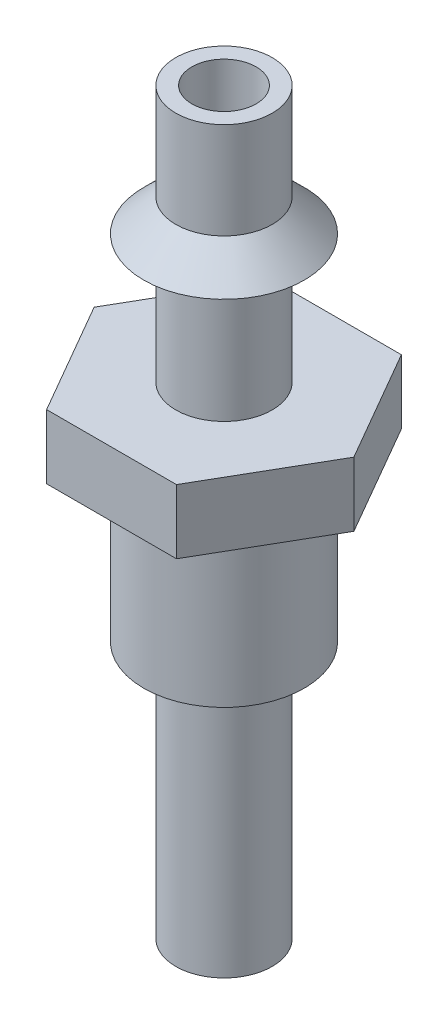
ISO-10303-21;
HEADER;
FILE_DESCRIPTION(('STEP AP214'),'2;1');
FILE_NAME('part.step','',(''),(''),'','','');
FILE_SCHEMA(('AUTOMOTIVE_DESIGN { 1 0 10303 214 1 1 1 1 }'));
ENDSEC;
DATA;
#1=APPLICATION_CONTEXT('core data for automotive mechanical design processes');
#2=APPLICATION_PROTOCOL_DEFINITION('international standard','automotive_design',2000,#1);
#3=PRODUCT_CONTEXT('',#1,'mechanical');
#4=PRODUCT('Part','Part','',(#3));
#5=PRODUCT_RELATED_PRODUCT_CATEGORY('part','',(#4));
#6=PRODUCT_DEFINITION_FORMATION('','',#4);
#7=PRODUCT_DEFINITION_CONTEXT('part definition',#1,'design');
#8=PRODUCT_DEFINITION('design','',#6,#7);
#9=PRODUCT_DEFINITION_SHAPE('','',#8);
#10=(LENGTH_UNIT() NAMED_UNIT(*) SI_UNIT(.MILLI.,.METRE.));
#11=(NAMED_UNIT(*) PLANE_ANGLE_UNIT() SI_UNIT($,.RADIAN.));
#12=(NAMED_UNIT(*) SI_UNIT($,.STERADIAN.) SOLID_ANGLE_UNIT());
#13=UNCERTAINTY_MEASURE_WITH_UNIT(LENGTH_MEASURE(1.E-05),#10,'distance_accuracy_value','');
#14=(GEOMETRIC_REPRESENTATION_CONTEXT(3) GLOBAL_UNCERTAINTY_ASSIGNED_CONTEXT((#13)) GLOBAL_UNIT_ASSIGNED_CONTEXT((#10,
#11,#12)) REPRESENTATION_CONTEXT('',''));
#15=CARTESIAN_POINT('',(0.,0.,0.));
#16=DIRECTION('',(0.,0.,1.));
#17=DIRECTION('',(1.,0.,0.));
#18=AXIS2_PLACEMENT_3D('',#15,#16,#17);
#19=CARTESIAN_POINT('',(0.,23.,0.));
#20=DIRECTION('',(0.,-1.,0.));
#21=DIRECTION('',(0.,0.,-1.));
#22=AXIS2_PLACEMENT_3D('',#19,#20,#21);
#23=CYLINDRICAL_SURFACE('',#22,1.5);
#24=CARTESIAN_POINT('',(0.,15.,0.));
#25=DIRECTION('',(0.,1.,0.));
#26=DIRECTION('',(0.,0.,1.));
#27=AXIS2_PLACEMENT_3D('',#24,#25,#26);
#28=CIRCLE('',#27,1.5);
#29=CARTESIAN_POINT('',(0.,15.,1.5));
#30=VERTEX_POINT('',#29);
#31=EDGE_CURVE('E143',#30,#30,#28,.T.);
#32=ORIENTED_EDGE('',*,*,#31,.T.);
#33=EDGE_LOOP('',(#32));
#34=FACE_BOUND('',#33,.T.);
#35=CARTESIAN_POINT('',(0.,19.,0.));
#36=DIRECTION('',(0.,1.,0.));
#37=DIRECTION('',(0.,0.,1.));
#38=AXIS2_PLACEMENT_3D('',#35,#36,#37);
#39=CIRCLE('',#38,1.5);
#40=CARTESIAN_POINT('',(0.,19.,1.5));
#41=VERTEX_POINT('',#40);
#42=EDGE_CURVE('E11',#41,#41,#39,.T.);
#43=ORIENTED_EDGE('',*,*,#42,.F.);
#44=EDGE_LOOP('',(#43));
#45=FACE_BOUND('',#44,.T.);
#46=ADVANCED_FACE('F37',(#34,#45),#23,.T.);
#47=CARTESIAN_POINT('',(0.,13.,0.));
#48=DIRECTION('',(0.,-1.,0.));
#49=DIRECTION('',(0.,0.,-1.));
#50=AXIS2_PLACEMENT_3D('',#47,#48,#49);
#51=CYLINDRICAL_SURFACE('',#50,2.5);
#52=CARTESIAN_POINT('',(0.,13.,0.));
#53=DIRECTION('',(0.,1.,0.));
#54=DIRECTION('',(0.,0.,1.));
#55=AXIS2_PLACEMENT_3D('',#52,#53,#54);
#56=CIRCLE('',#55,2.5);
#57=CARTESIAN_POINT('',(0.,13.,2.5));
#58=VERTEX_POINT('',#57);
#59=EDGE_CURVE('E144',#58,#58,#56,.T.);
#60=ORIENTED_EDGE('',*,*,#59,.F.);
#61=EDGE_LOOP('',(#60));
#62=FACE_BOUND('',#61,.T.);
#63=CARTESIAN_POINT('',(0.,8.,0.));
#64=DIRECTION('',(0.,1.,0.));
#65=DIRECTION('',(0.,0.,1.));
#66=AXIS2_PLACEMENT_3D('',#63,#64,#65);
#67=CIRCLE('',#66,2.5);
#68=CARTESIAN_POINT('',(0.,8.,2.5));
#69=VERTEX_POINT('',#68);
#70=EDGE_CURVE('E148',#69,#69,#67,.T.);
#71=ORIENTED_EDGE('',*,*,#70,.T.);
#72=EDGE_LOOP('',(#71));
#73=FACE_BOUND('',#72,.T.);
#74=ADVANCED_FACE('F176',(#62,#73),#51,.T.);
#75=CARTESIAN_POINT('',(0.,8.,0.));
#76=DIRECTION('',(0.,1.,0.));
#77=DIRECTION('',(0.,0.,1.));
#78=AXIS2_PLACEMENT_3D('',#75,#76,#77);
#79=PLANE('',#78);
#80=CARTESIAN_POINT('',(0.,8.,0.));
#81=DIRECTION('',(0.,1.,0.));
#82=DIRECTION('',(0.,0.,1.));
#83=AXIS2_PLACEMENT_3D('',#80,#81,#82);
#84=CIRCLE('',#83,1.5);
#85=CARTESIAN_POINT('',(0.,8.,1.5));
#86=VERTEX_POINT('',#85);
#87=EDGE_CURVE('E46',#86,#86,#84,.T.);
#88=ORIENTED_EDGE('',*,*,#87,.T.);
#89=EDGE_LOOP('',(#88));
#90=FACE_BOUND('',#89,.T.);
#91=ORIENTED_EDGE('',*,*,#70,.F.);
#92=EDGE_LOOP('',(#91));
#93=FACE_BOUND('',#92,.T.);
#94=ADVANCED_FACE('F181',(#90,#93),#79,.F.);
#95=CARTESIAN_POINT('',(0.,0.,0.));
#96=DIRECTION('',(0.,1.,0.));
#97=DIRECTION('',(0.,0.,1.));
#98=AXIS2_PLACEMENT_3D('',#95,#96,#97);
#99=PLANE('',#98);
#100=CARTESIAN_POINT('',(0.,0.,0.));
#101=DIRECTION('',(0.,1.,0.));
#102=DIRECTION('',(0.,0.,1.));
#103=AXIS2_PLACEMENT_3D('',#100,#101,#102);
#104=CIRCLE('',#103,1.);
#105=CARTESIAN_POINT('',(0.,0.,1.));
#106=VERTEX_POINT('',#105);
#107=EDGE_CURVE('E210',#106,#106,#104,.T.);
#108=ORIENTED_EDGE('',*,*,#107,.T.);
#109=EDGE_LOOP('',(#108));
#110=FACE_BOUND('',#109,.T.);
#111=CARTESIAN_POINT('',(0.,0.,0.));
#112=DIRECTION('',(0.,1.,0.));
#113=DIRECTION('',(0.,0.,1.));
#114=AXIS2_PLACEMENT_3D('',#111,#112,#113);
#115=CIRCLE('',#114,1.5);
#116=CARTESIAN_POINT('',(0.,0.,1.5));
#117=VERTEX_POINT('',#116);
#118=EDGE_CURVE('E147',#117,#117,#115,.T.);
#119=ORIENTED_EDGE('',*,*,#118,.F.);
#120=EDGE_LOOP('',(#119));
#121=FACE_BOUND('',#120,.T.);
#122=ADVANCED_FACE('F186',(#110,#121),#99,.F.);
#123=ORIENTED_EDGE('',*,*,#118,.T.);
#124=EDGE_LOOP('',(#123));
#125=FACE_BOUND('',#124,.T.);
#126=ORIENTED_EDGE('',*,*,#87,.F.);
#127=EDGE_LOOP('',(#126));
#128=FACE_BOUND('',#127,.T.);
#129=ADVANCED_FACE('F177',(#125,#128),#23,.T.);
#130=CARTESIAN_POINT('',(2.02072594216369,15.,-3.5));
#131=DIRECTION('',(0.,0.,1.));
#132=DIRECTION('',(1.,0.,0.));
#133=AXIS2_PLACEMENT_3D('',#130,#131,#132);
#134=PLANE('',#133);
#135=DIRECTION('',(-1.,0.,0.));
#136=VECTOR('',#135,1.);
#137=CARTESIAN_POINT('',(2.02072594216369,13.,-3.5));
#138=LINE('',#137,#136);
#139=CARTESIAN_POINT('',(2.02072594216369,13.,-3.5));
#140=VERTEX_POINT('',#139);
#141=CARTESIAN_POINT('',(-2.02072594216369,13.,-3.5));
#142=VERTEX_POINT('',#141);
#143=EDGE_CURVE('E123',#140,#142,#138,.T.);
#144=ORIENTED_EDGE('',*,*,#143,.T.);
#145=DIRECTION('',(0.,-1.,0.));
#146=VECTOR('',#145,1.);
#147=CARTESIAN_POINT('',(-2.02072594216369,15.,-3.5));
#148=LINE('',#147,#146);
#149=CARTESIAN_POINT('',(-2.02072594216369,15.,-3.5));
#150=VERTEX_POINT('',#149);
#151=EDGE_CURVE('E141',#150,#142,#148,.T.);
#152=ORIENTED_EDGE('',*,*,#151,.F.);
#153=DIRECTION('',(-1.,0.,0.));
#154=VECTOR('',#153,1.);
#155=CARTESIAN_POINT('',(2.02072594216369,15.,-3.5));
#156=LINE('',#155,#154);
#157=CARTESIAN_POINT('',(2.02072594216369,15.,-3.5));
#158=VERTEX_POINT('',#157);
#159=EDGE_CURVE('E134',#158,#150,#156,.T.);
#160=ORIENTED_EDGE('',*,*,#159,.F.);
#161=DIRECTION('',(0.,-1.,0.));
#162=VECTOR('',#161,1.);
#163=CARTESIAN_POINT('',(2.02072594216369,15.,-3.5));
#164=LINE('',#163,#162);
#165=EDGE_CURVE('E119',#158,#140,#164,.T.);
#166=ORIENTED_EDGE('',*,*,#165,.T.);
#167=EDGE_LOOP('',(#144,#152,#160,#166));
#168=FACE_BOUND('',#167,.T.);
#169=ADVANCED_FACE('F185',(#168),#134,.F.);
#170=CARTESIAN_POINT('',(-2.02072594216369,15.,-3.5));
#171=DIRECTION('',(0.866025403784439,0.,0.5));
#172=DIRECTION('',(0.5,0.,-0.866025403784439));
#173=AXIS2_PLACEMENT_3D('',#170,#171,#172);
#174=PLANE('',#173);
#175=DIRECTION('',(-0.5,0.,0.866025403784438));
#176=VECTOR('',#175,1.);
#177=CARTESIAN_POINT('',(-2.02072594216369,13.,-3.5));
#178=LINE('',#177,#176);
#179=CARTESIAN_POINT('',(-4.04145188432738,13.,0.));
#180=VERTEX_POINT('',#179);
#181=EDGE_CURVE('E126',#142,#180,#178,.T.);
#182=ORIENTED_EDGE('',*,*,#181,.T.);
#183=DIRECTION('',(0.,-1.,0.));
#184=VECTOR('',#183,1.);
#185=CARTESIAN_POINT('',(-4.04145188432738,15.,0.));
#186=LINE('',#185,#184);
#187=CARTESIAN_POINT('',(-4.04145188432738,15.,0.));
#188=VERTEX_POINT('',#187);
#189=EDGE_CURVE('E138',#188,#180,#186,.T.);
#190=ORIENTED_EDGE('',*,*,#189,.F.);
#191=DIRECTION('',(-0.5,0.,0.866025403784438));
#192=VECTOR('',#191,1.);
#193=CARTESIAN_POINT('',(-2.02072594216369,15.,-3.5));
#194=LINE('',#193,#192);
#195=EDGE_CURVE('E92',#150,#188,#194,.T.);
#196=ORIENTED_EDGE('',*,*,#195,.F.);
#197=ORIENTED_EDGE('',*,*,#151,.T.);
#198=EDGE_LOOP('',(#182,#190,#196,#197));
#199=FACE_BOUND('',#198,.T.);
#200=ADVANCED_FACE('F217',(#199),#174,.F.);
#201=CARTESIAN_POINT('',(-4.04145188432738,15.,0.));
#202=DIRECTION('',(0.866025403784439,0.,-0.5));
#203=DIRECTION('',(-0.5,0.,-0.866025403784439));
#204=AXIS2_PLACEMENT_3D('',#201,#202,#203);
#205=PLANE('',#204);
#206=DIRECTION('',(0.5,0.,0.866025403784439));
#207=VECTOR('',#206,1.);
#208=CARTESIAN_POINT('',(-4.04145188432738,13.,0.));
#209=LINE('',#208,#207);
#210=CARTESIAN_POINT('',(-2.02072594216369,13.,3.5));
#211=VERTEX_POINT('',#210);
#212=EDGE_CURVE('E129',#180,#211,#209,.T.);
#213=ORIENTED_EDGE('',*,*,#212,.T.);
#214=DIRECTION('',(0.,-1.,0.));
#215=VECTOR('',#214,1.);
#216=CARTESIAN_POINT('',(-2.02072594216369,15.,3.5));
#217=LINE('',#216,#215);
#218=CARTESIAN_POINT('',(-2.02072594216369,15.,3.5));
#219=VERTEX_POINT('',#218);
#220=EDGE_CURVE('E114',#219,#211,#217,.T.);
#221=ORIENTED_EDGE('',*,*,#220,.F.);
#222=DIRECTION('',(0.5,0.,0.866025403784439));
#223=VECTOR('',#222,1.);
#224=CARTESIAN_POINT('',(-4.04145188432738,15.,0.));
#225=LINE('',#224,#223);
#226=EDGE_CURVE('E105',#188,#219,#225,.T.);
#227=ORIENTED_EDGE('',*,*,#226,.F.);
#228=ORIENTED_EDGE('',*,*,#189,.T.);
#229=EDGE_LOOP('',(#213,#221,#227,#228));
#230=FACE_BOUND('',#229,.T.);
#231=ADVANCED_FACE('F220',(#230),#205,.F.);
#232=CARTESIAN_POINT('',(-2.02072594216369,15.,3.5));
#233=DIRECTION('',(0.,0.,-1.));
#234=DIRECTION('',(-1.,0.,0.));
#235=AXIS2_PLACEMENT_3D('',#232,#233,#234);
#236=PLANE('',#235);
#237=DIRECTION('',(1.,0.,0.));
#238=VECTOR('',#237,1.);
#239=CARTESIAN_POINT('',(-2.02072594216369,13.,3.5));
#240=LINE('',#239,#238);
#241=CARTESIAN_POINT('',(2.02072594216369,13.,3.5));
#242=VERTEX_POINT('',#241);
#243=EDGE_CURVE('E113',#211,#242,#240,.T.);
#244=ORIENTED_EDGE('',*,*,#243,.T.);
#245=DIRECTION('',(0.,-1.,0.));
#246=VECTOR('',#245,1.);
#247=CARTESIAN_POINT('',(2.02072594216369,15.,3.5));
#248=LINE('',#247,#246);
#249=CARTESIAN_POINT('',(2.02072594216369,15.,3.5));
#250=VERTEX_POINT('',#249);
#251=EDGE_CURVE('E110',#250,#242,#248,.T.);
#252=ORIENTED_EDGE('',*,*,#251,.F.);
#253=DIRECTION('',(1.,0.,0.));
#254=VECTOR('',#253,1.);
#255=CARTESIAN_POINT('',(-2.02072594216369,15.,3.5));
#256=LINE('',#255,#254);
#257=EDGE_CURVE('E99',#219,#250,#256,.T.);
#258=ORIENTED_EDGE('',*,*,#257,.F.);
#259=ORIENTED_EDGE('',*,*,#220,.T.);
#260=EDGE_LOOP('',(#244,#252,#258,#259));
#261=FACE_BOUND('',#260,.T.);
#262=ADVANCED_FACE('F111',(#261),#236,.F.);
#263=CARTESIAN_POINT('',(2.02072594216369,15.,3.5));
#264=DIRECTION('',(-0.866025403784439,0.,-0.5));
#265=DIRECTION('',(-0.5,0.,0.866025403784439));
#266=AXIS2_PLACEMENT_3D('',#263,#264,#265);
#267=PLANE('',#266);
#268=DIRECTION('',(0.5,0.,-0.866025403784439));
#269=VECTOR('',#268,1.);
#270=CARTESIAN_POINT('',(2.02072594216369,13.,3.5));
#271=LINE('',#270,#269);
#272=CARTESIAN_POINT('',(4.04145188432738,13.,0.));
#273=VERTEX_POINT('',#272);
#274=EDGE_CURVE('E77',#242,#273,#271,.T.);
#275=ORIENTED_EDGE('',*,*,#274,.T.);
#276=DIRECTION('',(0.,-1.,0.));
#277=VECTOR('',#276,1.);
#278=CARTESIAN_POINT('',(4.04145188432738,15.,0.));
#279=LINE('',#278,#277);
#280=CARTESIAN_POINT('',(4.04145188432738,15.,0.));
#281=VERTEX_POINT('',#280);
#282=EDGE_CURVE('E115',#281,#273,#279,.T.);
#283=ORIENTED_EDGE('',*,*,#282,.F.);
#284=DIRECTION('',(0.5,0.,-0.866025403784439));
#285=VECTOR('',#284,1.);
#286=CARTESIAN_POINT('',(2.02072594216369,15.,3.5));
#287=LINE('',#286,#285);
#288=EDGE_CURVE('E103',#250,#281,#287,.T.);
#289=ORIENTED_EDGE('',*,*,#288,.F.);
#290=ORIENTED_EDGE('',*,*,#251,.T.);
#291=EDGE_LOOP('',(#275,#283,#289,#290));
#292=FACE_BOUND('',#291,.T.);
#293=ADVANCED_FACE('F117',(#292),#267,.F.);
#294=CARTESIAN_POINT('',(4.04145188432738,15.,0.));
#295=DIRECTION('',(-0.866025403784439,0.,0.5));
#296=DIRECTION('',(0.5,0.,0.866025403784439));
#297=AXIS2_PLACEMENT_3D('',#294,#295,#296);
#298=PLANE('',#297);
#299=DIRECTION('',(-0.5,0.,-0.866025403784439));
#300=VECTOR('',#299,1.);
#301=CARTESIAN_POINT('',(4.04145188432738,13.,0.));
#302=LINE('',#301,#300);
#303=EDGE_CURVE('E83',#273,#140,#302,.T.);
#304=ORIENTED_EDGE('',*,*,#303,.T.);
#305=ORIENTED_EDGE('',*,*,#165,.F.);
#306=DIRECTION('',(-0.5,0.,-0.866025403784439));
#307=VECTOR('',#306,1.);
#308=CARTESIAN_POINT('',(4.04145188432738,15.,0.));
#309=LINE('',#308,#307);
#310=EDGE_CURVE('E54',#281,#158,#309,.T.);
#311=ORIENTED_EDGE('',*,*,#310,.F.);
#312=ORIENTED_EDGE('',*,*,#282,.T.);
#313=EDGE_LOOP('',(#304,#305,#311,#312));
#314=FACE_BOUND('',#313,.T.);
#315=ADVANCED_FACE('F164',(#314),#298,.F.);
#316=CARTESIAN_POINT('',(0.,15.,0.));
#317=DIRECTION('',(0.,1.,0.));
#318=DIRECTION('',(0.,0.,1.));
#319=AXIS2_PLACEMENT_3D('',#316,#317,#318);
#320=PLANE('',#319);
#321=ORIENTED_EDGE('',*,*,#31,.F.);
#322=EDGE_LOOP('',(#321));
#323=FACE_BOUND('',#322,.T.);
#324=ORIENTED_EDGE('',*,*,#159,.T.);
#325=ORIENTED_EDGE('',*,*,#195,.T.);
#326=ORIENTED_EDGE('',*,*,#226,.T.);
#327=ORIENTED_EDGE('',*,*,#257,.T.);
#328=ORIENTED_EDGE('',*,*,#288,.T.);
#329=ORIENTED_EDGE('',*,*,#310,.T.);
#330=EDGE_LOOP('',(#324,#325,#326,#327,#328,#329));
#331=FACE_BOUND('',#330,.T.);
#332=ADVANCED_FACE('F101',(#323,#331),#320,.T.);
#333=CARTESIAN_POINT('',(0.,13.,0.));
#334=DIRECTION('',(0.,1.,0.));
#335=DIRECTION('',(0.,0.,1.));
#336=AXIS2_PLACEMENT_3D('',#333,#334,#335);
#337=PLANE('',#336);
#338=ORIENTED_EDGE('',*,*,#59,.T.);
#339=EDGE_LOOP('',(#338));
#340=FACE_BOUND('',#339,.T.);
#341=ORIENTED_EDGE('',*,*,#143,.F.);
#342=ORIENTED_EDGE('',*,*,#303,.F.);
#343=ORIENTED_EDGE('',*,*,#274,.F.);
#344=ORIENTED_EDGE('',*,*,#243,.F.);
#345=ORIENTED_EDGE('',*,*,#212,.F.);
#346=ORIENTED_EDGE('',*,*,#181,.F.);
#347=EDGE_LOOP('',(#341,#342,#343,#344,#345,#346));
#348=FACE_BOUND('',#347,.T.);
#349=ADVANCED_FACE('F163',(#340,#348),#337,.F.);
#350=CARTESIAN_POINT('',(0.,19.,0.));
#351=DIRECTION('',(0.,-1.,0.));
#352=DIRECTION('',(0.,0.,1.));
#353=AXIS2_PLACEMENT_3D('',#350,#351,#352);
#354=CONICAL_SURFACE('',#353,2.5,0.78539816339745);
#355=CARTESIAN_POINT('',(0.,20.,0.));
#356=DIRECTION('',(0.,1.,0.));
#357=DIRECTION('',(0.,0.,1.));
#358=AXIS2_PLACEMENT_3D('',#355,#356,#357);
#359=CIRCLE('',#358,1.5);
#360=CARTESIAN_POINT('',(0.,20.,1.5));
#361=VERTEX_POINT('',#360);
#362=EDGE_CURVE('E127',#361,#361,#359,.T.);
#363=ORIENTED_EDGE('',*,*,#362,.F.);
#364=EDGE_LOOP('',(#363));
#365=FACE_BOUND('',#364,.T.);
#366=CARTESIAN_POINT('',(0.,19.,0.));
#367=DIRECTION('',(0.,1.,0.));
#368=DIRECTION('',(0.,0.,1.));
#369=AXIS2_PLACEMENT_3D('',#366,#367,#368);
#370=CIRCLE('',#369,2.5);
#371=CARTESIAN_POINT('',(0.,19.,2.5));
#372=VERTEX_POINT('',#371);
#373=EDGE_CURVE('E207',#372,#372,#370,.T.);
#374=ORIENTED_EDGE('',*,*,#373,.T.);
#375=EDGE_LOOP('',(#374));
#376=FACE_BOUND('',#375,.T.);
#377=ADVANCED_FACE('F170',(#365,#376),#354,.T.);
#378=CARTESIAN_POINT('',(0.,19.,0.));
#379=DIRECTION('',(0.,1.,0.));
#380=DIRECTION('',(0.,0.,1.));
#381=AXIS2_PLACEMENT_3D('',#378,#379,#380);
#382=PLANE('',#381);
#383=ORIENTED_EDGE('',*,*,#42,.T.);
#384=EDGE_LOOP('',(#383));
#385=FACE_BOUND('',#384,.T.);
#386=ORIENTED_EDGE('',*,*,#373,.F.);
#387=EDGE_LOOP('',(#386));
#388=FACE_BOUND('',#387,.T.);
#389=ADVANCED_FACE('F198',(#385,#388),#382,.F.);
#390=CARTESIAN_POINT('',(0.,23.,0.));
#391=DIRECTION('',(0.,1.,0.));
#392=DIRECTION('',(0.,0.,1.));
#393=AXIS2_PLACEMENT_3D('',#390,#391,#392);
#394=PLANE('',#393);
#395=CARTESIAN_POINT('',(0.,23.,0.));
#396=DIRECTION('',(0.,-1.,0.));
#397=DIRECTION('',(0.,0.,-1.));
#398=AXIS2_PLACEMENT_3D('',#395,#396,#397);
#399=CIRCLE('',#398,1.);
#400=CARTESIAN_POINT('',(0.,23.,-1.));
#401=VERTEX_POINT('',#400);
#402=EDGE_CURVE('E248',#401,#401,#399,.T.);
#403=ORIENTED_EDGE('',*,*,#402,.T.);
#404=EDGE_LOOP('',(#403));
#405=FACE_BOUND('',#404,.T.);
#406=CARTESIAN_POINT('',(0.,23.,0.));
#407=DIRECTION('',(0.,1.,0.));
#408=DIRECTION('',(0.,0.,1.));
#409=AXIS2_PLACEMENT_3D('',#406,#407,#408);
#410=CIRCLE('',#409,1.5);
#411=CARTESIAN_POINT('',(0.,23.,1.5));
#412=VERTEX_POINT('',#411);
#413=EDGE_CURVE('E151',#412,#412,#410,.T.);
#414=ORIENTED_EDGE('',*,*,#413,.T.);
#415=EDGE_LOOP('',(#414));
#416=FACE_BOUND('',#415,.T.);
#417=ADVANCED_FACE('F190',(#405,#416),#394,.T.);
#418=ORIENTED_EDGE('',*,*,#362,.T.);
#419=EDGE_LOOP('',(#418));
#420=FACE_BOUND('',#419,.T.);
#421=ORIENTED_EDGE('',*,*,#413,.F.);
#422=EDGE_LOOP('',(#421));
#423=FACE_BOUND('',#422,.T.);
#424=ADVANCED_FACE('F39',(#420,#423),#23,.T.);
#425=CARTESIAN_POINT('',(0.,23.,0.));
#426=DIRECTION('',(0.,-1.,0.));
#427=DIRECTION('',(0.,0.,-1.));
#428=AXIS2_PLACEMENT_3D('',#425,#426,#427);
#429=CYLINDRICAL_SURFACE('',#428,1.);
#430=ORIENTED_EDGE('',*,*,#402,.F.);
#431=EDGE_LOOP('',(#430));
#432=FACE_BOUND('',#431,.T.);
#433=ORIENTED_EDGE('',*,*,#107,.F.);
#434=EDGE_LOOP('',(#433));
#435=FACE_BOUND('',#434,.T.);
#436=ADVANCED_FACE('F189',(#432,#435),#429,.F.);
#437=CLOSED_SHELL('',(#46,#74,#94,#122,#129,#169,#200,#231,#262,#293,#315,#332,#349,#377,#389,
#417,#424,#436));
#438=MANIFOLD_SOLID_BREP('B2',#437);
#439=ADVANCED_BREP_SHAPE_REPRESENTATION('',(#18,#438),#14);
#440=SHAPE_DEFINITION_REPRESENTATION(#9,#439);
ENDSEC;
END-ISO-10303-21;
